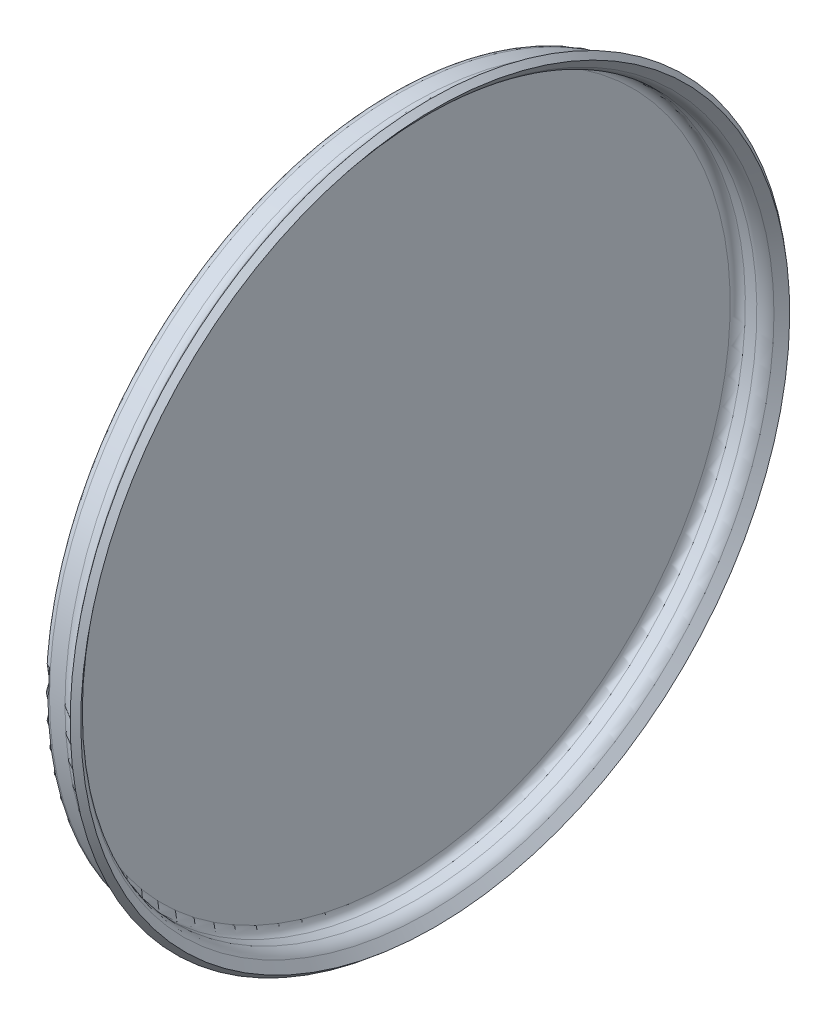
ISO-10303-21;
HEADER;
FILE_DESCRIPTION(('STEP AP214'),'2;1');
FILE_NAME('part.step','',(''),(''),'','','');
FILE_SCHEMA(('AUTOMOTIVE_DESIGN { 1 0 10303 214 1 1 1 1 }'));
ENDSEC;
DATA;
#1=APPLICATION_CONTEXT('core data for automotive mechanical design processes');
#2=APPLICATION_PROTOCOL_DEFINITION('international standard','automotive_design',2000,#1);
#3=PRODUCT_CONTEXT('',#1,'mechanical');
#4=PRODUCT('Part','Part','',(#3));
#5=PRODUCT_RELATED_PRODUCT_CATEGORY('part','',(#4));
#6=PRODUCT_DEFINITION_FORMATION('','',#4);
#7=PRODUCT_DEFINITION_CONTEXT('part definition',#1,'design');
#8=PRODUCT_DEFINITION('design','',#6,#7);
#9=PRODUCT_DEFINITION_SHAPE('','',#8);
#10=(LENGTH_UNIT() NAMED_UNIT(*) SI_UNIT(.MILLI.,.METRE.));
#11=(NAMED_UNIT(*) PLANE_ANGLE_UNIT() SI_UNIT($,.RADIAN.));
#12=(NAMED_UNIT(*) SI_UNIT($,.STERADIAN.) SOLID_ANGLE_UNIT());
#13=UNCERTAINTY_MEASURE_WITH_UNIT(LENGTH_MEASURE(1.E-05),#10,'distance_accuracy_value','');
#14=(GEOMETRIC_REPRESENTATION_CONTEXT(3) GLOBAL_UNCERTAINTY_ASSIGNED_CONTEXT((#13)) GLOBAL_UNIT_ASSIGNED_CONTEXT((#10,
#11,#12)) REPRESENTATION_CONTEXT('',''));
#15=CARTESIAN_POINT('',(0.,0.,0.));
#16=DIRECTION('',(0.,0.,1.));
#17=DIRECTION('',(1.,0.,0.));
#18=AXIS2_PLACEMENT_3D('',#15,#16,#17);
#19=CARTESIAN_POINT('',(-31.0837472665404,-45.,0.));
#20=DIRECTION('',(-1.,0.,0.));
#21=DIRECTION('',(0.,-1.,0.));
#22=AXIS2_PLACEMENT_3D('',#19,#20,#21);
#23=PLANE('',#22);
#24=CARTESIAN_POINT('',(-31.0837472665404,0.,0.));
#25=DIRECTION('',(-1.,0.,0.));
#26=DIRECTION('',(0.,-1.,0.));
#27=AXIS2_PLACEMENT_3D('',#24,#25,#26);
#28=CIRCLE('',#27,45.);
#29=CARTESIAN_POINT('',(-31.0837472665404,-45.,0.));
#30=VERTEX_POINT('',#29);
#31=EDGE_CURVE('E10',#30,#30,#28,.T.);
#32=ORIENTED_EDGE('',*,*,#31,.T.);
#33=EDGE_LOOP('',(#32));
#34=FACE_BOUND('',#33,.T.);
#35=ADVANCED_FACE('F35',(#34),#23,.T.);
#36=CARTESIAN_POINT('',(-30.0837472665404,0.,0.));
#37=DIRECTION('',(-1.,0.,0.));
#38=DIRECTION('',(0.,-1.,0.));
#39=AXIS2_PLACEMENT_3D('',#36,#37,#38);
#40=TOROIDAL_SURFACE('',#39,45.,0.999999999999999);
#41=CARTESIAN_POINT('',(-30.0837472665404,0.,0.));
#42=DIRECTION('',(-1.,0.,0.));
#43=DIRECTION('',(0.,-1.,0.));
#44=AXIS2_PLACEMENT_3D('',#41,#42,#43);
#45=CIRCLE('',#44,46.);
#46=CARTESIAN_POINT('',(-30.0837472665404,-46.,0.));
#47=VERTEX_POINT('',#46);
#48=EDGE_CURVE('E41',#47,#47,#45,.T.);
#49=ORIENTED_EDGE('',*,*,#48,.T.);
#50=EDGE_LOOP('',(#49));
#51=FACE_BOUND('',#50,.T.);
#52=ORIENTED_EDGE('',*,*,#31,.F.);
#53=EDGE_LOOP('',(#52));
#54=FACE_BOUND('',#53,.T.);
#55=ADVANCED_FACE('F85',(#51,#54),#40,.T.);
#56=CARTESIAN_POINT('',(-28.0837472665404,0.,0.));
#57=DIRECTION('',(-1.,0.,0.));
#58=DIRECTION('',(0.,-1.,0.));
#59=AXIS2_PLACEMENT_3D('',#56,#57,#58);
#60=CYLINDRICAL_SURFACE('',#59,46.);
#61=CARTESIAN_POINT('',(-28.0361587554412,0.,0.));
#62=DIRECTION('',(-1.,0.,0.));
#63=DIRECTION('',(0.,-1.,0.));
#64=AXIS2_PLACEMENT_3D('',#61,#62,#63);
#65=CIRCLE('',#64,46.);
#66=CARTESIAN_POINT('',(-28.0361587554412,-46.,0.));
#67=VERTEX_POINT('',#66);
#68=EDGE_CURVE('E45',#67,#67,#65,.T.);
#69=ORIENTED_EDGE('',*,*,#68,.T.);
#70=EDGE_LOOP('',(#69));
#71=FACE_BOUND('',#70,.T.);
#72=ORIENTED_EDGE('',*,*,#48,.F.);
#73=EDGE_LOOP('',(#72));
#74=FACE_BOUND('',#73,.T.);
#75=ADVANCED_FACE('F89',(#71,#74),#60,.T.);
#76=CARTESIAN_POINT('',(-28.0361587554412,0.,0.));
#77=DIRECTION('',(-1.,0.,0.));
#78=DIRECTION('',(0.,-1.,0.));
#79=AXIS2_PLACEMENT_3D('',#76,#77,#78);
#80=TOROIDAL_SURFACE('',#79,48.,2.00000000000001);
#81=CARTESIAN_POINT('',(-26.4948682108196,0.,0.));
#82=DIRECTION('',(-1.,0.,0.));
#83=DIRECTION('',(0.,-1.,0.));
#84=AXIS2_PLACEMENT_3D('',#81,#82,#83);
#85=CIRCLE('',#84,46.7254712804098);
#86=CARTESIAN_POINT('',(-26.4948682108196,-46.7254712804098,0.));
#87=VERTEX_POINT('',#86);
#88=EDGE_CURVE('E49',#87,#87,#85,.T.);
#89=ORIENTED_EDGE('',*,*,#88,.T.);
#90=EDGE_LOOP('',(#89));
#91=FACE_BOUND('',#90,.T.);
#92=ORIENTED_EDGE('',*,*,#68,.F.);
#93=EDGE_LOOP('',(#92));
#94=FACE_BOUND('',#93,.T.);
#95=ADVANCED_FACE('F93',(#91,#94),#80,.F.);
#96=CARTESIAN_POINT('',(-26.4948682108196,0.,0.));
#97=DIRECTION('',(1.,0.,0.));
#98=DIRECTION('',(0.,1.,0.));
#99=AXIS2_PLACEMENT_3D('',#96,#97,#98);
#100=CONICAL_SURFACE('',#99,46.7254712804098,0.879853098792736);
#101=CARTESIAN_POINT('',(-25.8543925388512,0.,0.));
#102=DIRECTION('',(-1.,0.,0.));
#103=DIRECTION('',(0.,-1.,0.));
#104=AXIS2_PLACEMENT_3D('',#101,#102,#103);
#105=CIRCLE('',#104,47.4999999999999);
#106=CARTESIAN_POINT('',(-25.8543925388512,-47.4999999999999,0.));
#107=VERTEX_POINT('',#106);
#108=EDGE_CURVE('E54',#107,#107,#105,.T.);
#109=ORIENTED_EDGE('',*,*,#108,.T.);
#110=EDGE_LOOP('',(#109));
#111=FACE_BOUND('',#110,.T.);
#112=ORIENTED_EDGE('',*,*,#88,.F.);
#113=EDGE_LOOP('',(#112));
#114=FACE_BOUND('',#113,.T.);
#115=ADVANCED_FACE('F100',(#111,#114),#100,.T.);
#116=CARTESIAN_POINT('',(-25.8543925388512,0.,0.));
#117=DIRECTION('',(-1.,0.,0.));
#118=DIRECTION('',(0.,-1.,0.));
#119=AXIS2_PLACEMENT_3D('',#116,#117,#118);
#120=CONICAL_SURFACE('',#119,47.4999999999999,0.690943228002118);
#121=CARTESIAN_POINT('',(-25.0837472665404,0.,0.));
#122=DIRECTION('',(-1.,0.,0.));
#123=DIRECTION('',(0.,-1.,0.));
#124=AXIS2_PLACEMENT_3D('',#121,#122,#123);
#125=CIRCLE('',#124,46.8627356402049);
#126=CARTESIAN_POINT('',(-25.0837472665404,-46.8627356402049,0.));
#127=VERTEX_POINT('',#126);
#128=EDGE_CURVE('E57',#127,#127,#125,.T.);
#129=ORIENTED_EDGE('',*,*,#128,.T.);
#130=EDGE_LOOP('',(#129));
#131=FACE_BOUND('',#130,.T.);
#132=ORIENTED_EDGE('',*,*,#108,.F.);
#133=EDGE_LOOP('',(#132));
#134=FACE_BOUND('',#133,.T.);
#135=ADVANCED_FACE('F104',(#131,#134),#120,.T.);
#136=CARTESIAN_POINT('',(-25.0837472665404,0.,0.));
#137=DIRECTION('',(1.,0.,0.));
#138=DIRECTION('',(0.,1.,0.));
#139=AXIS2_PLACEMENT_3D('',#136,#137,#138);
#140=CONICAL_SURFACE('',#139,46.8627356402049,0.879853098792548);
#141=CARTESIAN_POINT('',(-26.0241774102169,0.,0.));
#142=DIRECTION('',(-1.,0.,0.));
#143=DIRECTION('',(0.,-1.,0.));
#144=AXIS2_PLACEMENT_3D('',#141,#142,#143);
#145=CIRCLE('',#144,45.72547128041);
#146=CARTESIAN_POINT('',(-26.0241774102169,-45.72547128041,0.));
#147=VERTEX_POINT('',#146);
#148=EDGE_CURVE('E60',#147,#147,#145,.T.);
#149=ORIENTED_EDGE('',*,*,#148,.T.);
#150=EDGE_LOOP('',(#149));
#151=FACE_BOUND('',#150,.T.);
#152=ORIENTED_EDGE('',*,*,#128,.F.);
#153=EDGE_LOOP('',(#152));
#154=FACE_BOUND('',#153,.T.);
#155=ADVANCED_FACE('F108',(#151,#154),#140,.F.);
#156=CARTESIAN_POINT('',(-27.5654679548389,0.,0.));
#157=DIRECTION('',(-1.,0.,0.));
#158=DIRECTION('',(0.,-1.,0.));
#159=AXIS2_PLACEMENT_3D('',#156,#157,#158);
#160=TOROIDAL_SURFACE('',#159,47.,2.00000000000026);
#161=CARTESIAN_POINT('',(-27.5654679548382,0.,0.));
#162=DIRECTION('',(-1.,0.,0.));
#163=DIRECTION('',(0.,-1.,0.));
#164=AXIS2_PLACEMENT_3D('',#161,#162,#163);
#165=CIRCLE('',#164,45.);
#166=CARTESIAN_POINT('',(-27.5654679548382,-45.,0.));
#167=VERTEX_POINT('',#166);
#168=EDGE_CURVE('E63',#167,#167,#165,.T.);
#169=ORIENTED_EDGE('',*,*,#168,.T.);
#170=EDGE_LOOP('',(#169));
#171=FACE_BOUND('',#170,.T.);
#172=ORIENTED_EDGE('',*,*,#148,.F.);
#173=EDGE_LOOP('',(#172));
#174=FACE_BOUND('',#173,.T.);
#175=ADVANCED_FACE('F112',(#171,#174),#160,.T.);
#176=CARTESIAN_POINT('',(-28.0837472665404,0.,0.));
#177=DIRECTION('',(-1.,0.,0.));
#178=DIRECTION('',(0.,-1.,0.));
#179=AXIS2_PLACEMENT_3D('',#176,#177,#178);
#180=CYLINDRICAL_SURFACE('',#179,45.);
#181=CARTESIAN_POINT('',(-29.0837472665404,0.,0.));
#182=DIRECTION('',(-1.,0.,0.));
#183=DIRECTION('',(0.,-1.,0.));
#184=AXIS2_PLACEMENT_3D('',#181,#182,#183);
#185=CIRCLE('',#184,45.);
#186=CARTESIAN_POINT('',(-29.0837472665404,-45.,0.));
#187=VERTEX_POINT('',#186);
#188=EDGE_CURVE('E66',#187,#187,#185,.T.);
#189=ORIENTED_EDGE('',*,*,#188,.T.);
#190=EDGE_LOOP('',(#189));
#191=FACE_BOUND('',#190,.T.);
#192=ORIENTED_EDGE('',*,*,#168,.F.);
#193=EDGE_LOOP('',(#192));
#194=FACE_BOUND('',#193,.T.);
#195=ADVANCED_FACE('F82',(#191,#194),#180,.F.);
#196=CARTESIAN_POINT('',(-29.0837472665404,0.,0.));
#197=DIRECTION('',(-1.,0.,0.));
#198=DIRECTION('',(0.,-1.,0.));
#199=AXIS2_PLACEMENT_3D('',#196,#197,#198);
#200=TOROIDAL_SURFACE('',#199,44.,0.999999999999997);
#201=CARTESIAN_POINT('',(-30.0837472665404,0.,0.));
#202=DIRECTION('',(-1.,0.,0.));
#203=DIRECTION('',(0.,-1.,0.));
#204=AXIS2_PLACEMENT_3D('',#201,#202,#203);
#205=CIRCLE('',#204,44.);
#206=CARTESIAN_POINT('',(-30.0837472665404,-44.,0.));
#207=VERTEX_POINT('',#206);
#208=EDGE_CURVE('E69',#207,#207,#205,.T.);
#209=ORIENTED_EDGE('',*,*,#208,.T.);
#210=EDGE_LOOP('',(#209));
#211=FACE_BOUND('',#210,.T.);
#212=ORIENTED_EDGE('',*,*,#188,.F.);
#213=EDGE_LOOP('',(#212));
#214=FACE_BOUND('',#213,.T.);
#215=ADVANCED_FACE('F73',(#211,#214),#200,.F.);
#216=CARTESIAN_POINT('',(-30.0837472665404,-30.5,0.));
#217=DIRECTION('',(1.,0.,0.));
#218=DIRECTION('',(0.,1.,0.));
#219=AXIS2_PLACEMENT_3D('',#216,#217,#218);
#220=PLANE('',#219);
#221=ORIENTED_EDGE('',*,*,#208,.F.);
#222=EDGE_LOOP('',(#221));
#223=FACE_BOUND('',#222,.T.);
#224=ADVANCED_FACE('F76',(#223),#220,.T.);
#225=CLOSED_SHELL('',(#35,#55,#75,#95,#115,#135,#155,#175,#195,#215,#224));
#226=MANIFOLD_SOLID_BREP('B2',#225);
#227=ADVANCED_BREP_SHAPE_REPRESENTATION('',(#18,#226),#14);
#228=SHAPE_DEFINITION_REPRESENTATION(#9,#227);
ENDSEC;
END-ISO-10303-21;
